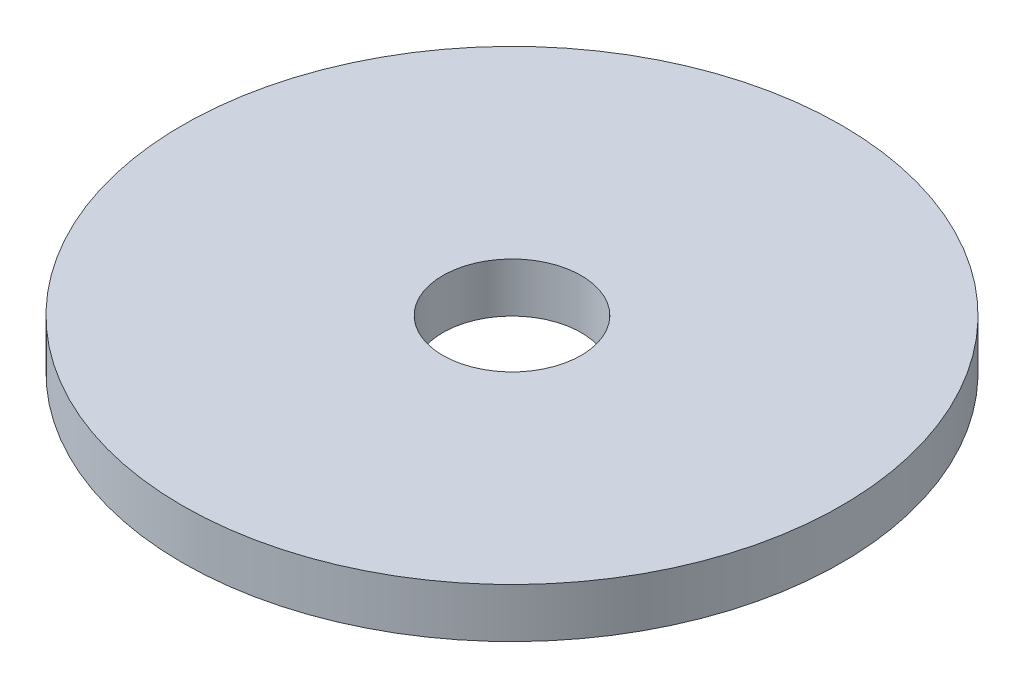
ISO-10303-21;
HEADER;
FILE_DESCRIPTION(('STEP AP214'),'2;1');
FILE_NAME('part.step','',(''),(''),'','','');
FILE_SCHEMA(('AUTOMOTIVE_DESIGN { 1 0 10303 214 1 1 1 1 }'));
ENDSEC;
DATA;
#1=APPLICATION_CONTEXT('core data for automotive mechanical design processes');
#2=APPLICATION_PROTOCOL_DEFINITION('international standard','automotive_design',2000,#1);
#3=PRODUCT_CONTEXT('',#1,'mechanical');
#4=PRODUCT('Part','Part','',(#3));
#5=PRODUCT_RELATED_PRODUCT_CATEGORY('part','',(#4));
#6=PRODUCT_DEFINITION_FORMATION('','',#4);
#7=PRODUCT_DEFINITION_CONTEXT('part definition',#1,'design');
#8=PRODUCT_DEFINITION('design','',#6,#7);
#9=PRODUCT_DEFINITION_SHAPE('','',#8);
#10=(LENGTH_UNIT() NAMED_UNIT(*) SI_UNIT(.MILLI.,.METRE.));
#11=(NAMED_UNIT(*) PLANE_ANGLE_UNIT() SI_UNIT($,.RADIAN.));
#12=(NAMED_UNIT(*) SI_UNIT($,.STERADIAN.) SOLID_ANGLE_UNIT());
#13=UNCERTAINTY_MEASURE_WITH_UNIT(LENGTH_MEASURE(1.E-05),#10,'distance_accuracy_value','');
#14=(GEOMETRIC_REPRESENTATION_CONTEXT(3) GLOBAL_UNCERTAINTY_ASSIGNED_CONTEXT((#13)) GLOBAL_UNIT_ASSIGNED_CONTEXT((#10,
#11,#12)) REPRESENTATION_CONTEXT('',''));
#15=CARTESIAN_POINT('',(0.,0.,0.));
#16=DIRECTION('',(0.,0.,1.));
#17=DIRECTION('',(1.,0.,0.));
#18=AXIS2_PLACEMENT_3D('',#15,#16,#17);
#19=CARTESIAN_POINT('',(0.,1.5,0.));
#20=DIRECTION('',(0.,1.,0.));
#21=DIRECTION('',(0.,0.,1.));
#22=AXIS2_PLACEMENT_3D('',#19,#20,#21);
#23=PLANE('',#22);
#24=CARTESIAN_POINT('',(0.,1.5,0.));
#25=DIRECTION('',(0.,1.,0.));
#26=DIRECTION('',(0.,0.,1.));
#27=AXIS2_PLACEMENT_3D('',#24,#25,#26);
#28=CIRCLE('',#27,10.);
#29=CARTESIAN_POINT('',(0.,1.5,10.));
#30=VERTEX_POINT('',#29);
#31=EDGE_CURVE('E10',#30,#30,#28,.T.);
#32=ORIENTED_EDGE('',*,*,#31,.T.);
#33=EDGE_LOOP('',(#32));
#34=FACE_BOUND('',#33,.T.);
#35=CARTESIAN_POINT('',(0.,1.5,0.));
#36=DIRECTION('',(0.,1.,0.));
#37=DIRECTION('',(0.,0.,1.));
#38=AXIS2_PLACEMENT_3D('',#35,#36,#37);
#39=CIRCLE('',#38,2.1);
#40=CARTESIAN_POINT('',(0.,1.5,2.1));
#41=VERTEX_POINT('',#40);
#42=EDGE_CURVE('E50',#41,#41,#39,.T.);
#43=ORIENTED_EDGE('',*,*,#42,.F.);
#44=EDGE_LOOP('',(#43));
#45=FACE_BOUND('',#44,.T.);
#46=ADVANCED_FACE('F39',(#34,#45),#23,.T.);
#47=CARTESIAN_POINT('',(0.,0.,0.));
#48=DIRECTION('',(0.,1.,0.));
#49=DIRECTION('',(0.,0.,1.));
#50=AXIS2_PLACEMENT_3D('',#47,#48,#49);
#51=PLANE('',#50);
#52=CARTESIAN_POINT('',(0.,0.,0.));
#53=DIRECTION('',(0.,1.,0.));
#54=DIRECTION('',(0.,0.,1.));
#55=AXIS2_PLACEMENT_3D('',#52,#53,#54);
#56=CIRCLE('',#55,10.);
#57=CARTESIAN_POINT('',(0.,0.,10.));
#58=VERTEX_POINT('',#57);
#59=EDGE_CURVE('E43',#58,#58,#56,.T.);
#60=ORIENTED_EDGE('',*,*,#59,.F.);
#61=EDGE_LOOP('',(#60));
#62=FACE_BOUND('',#61,.T.);
#63=CARTESIAN_POINT('',(0.,0.,0.));
#64=DIRECTION('',(0.,1.,0.));
#65=DIRECTION('',(0.,0.,1.));
#66=AXIS2_PLACEMENT_3D('',#63,#64,#65);
#67=CIRCLE('',#66,2.1);
#68=CARTESIAN_POINT('',(0.,0.,2.1));
#69=VERTEX_POINT('',#68);
#70=EDGE_CURVE('E52',#69,#69,#67,.T.);
#71=ORIENTED_EDGE('',*,*,#70,.T.);
#72=EDGE_LOOP('',(#71));
#73=FACE_BOUND('',#72,.T.);
#74=ADVANCED_FACE('F62',(#62,#73),#51,.F.);
#75=CARTESIAN_POINT('',(0.,1.5,0.));
#76=DIRECTION('',(0.,-1.,0.));
#77=DIRECTION('',(0.,0.,-1.));
#78=AXIS2_PLACEMENT_3D('',#75,#76,#77);
#79=CYLINDRICAL_SURFACE('',#78,10.);
#80=ORIENTED_EDGE('',*,*,#31,.F.);
#81=EDGE_LOOP('',(#80));
#82=FACE_BOUND('',#81,.T.);
#83=ORIENTED_EDGE('',*,*,#59,.T.);
#84=EDGE_LOOP('',(#83));
#85=FACE_BOUND('',#84,.T.);
#86=ADVANCED_FACE('F41',(#82,#85),#79,.T.);
#87=CARTESIAN_POINT('',(0.,1.5,0.));
#88=DIRECTION('',(0.,-1.,0.));
#89=DIRECTION('',(0.,0.,-1.));
#90=AXIS2_PLACEMENT_3D('',#87,#88,#89);
#91=CYLINDRICAL_SURFACE('',#90,2.1);
#92=ORIENTED_EDGE('',*,*,#42,.T.);
#93=EDGE_LOOP('',(#92));
#94=FACE_BOUND('',#93,.T.);
#95=ORIENTED_EDGE('',*,*,#70,.F.);
#96=EDGE_LOOP('',(#95));
#97=FACE_BOUND('',#96,.T.);
#98=ADVANCED_FACE('F58',(#94,#97),#91,.F.);
#99=CLOSED_SHELL('',(#46,#74,#86,#98));
#100=MANIFOLD_SOLID_BREP('B2',#99);
#101=ADVANCED_BREP_SHAPE_REPRESENTATION('',(#18,#100),#14);
#102=SHAPE_DEFINITION_REPRESENTATION(#9,#101);
ENDSEC;
END-ISO-10303-21;
